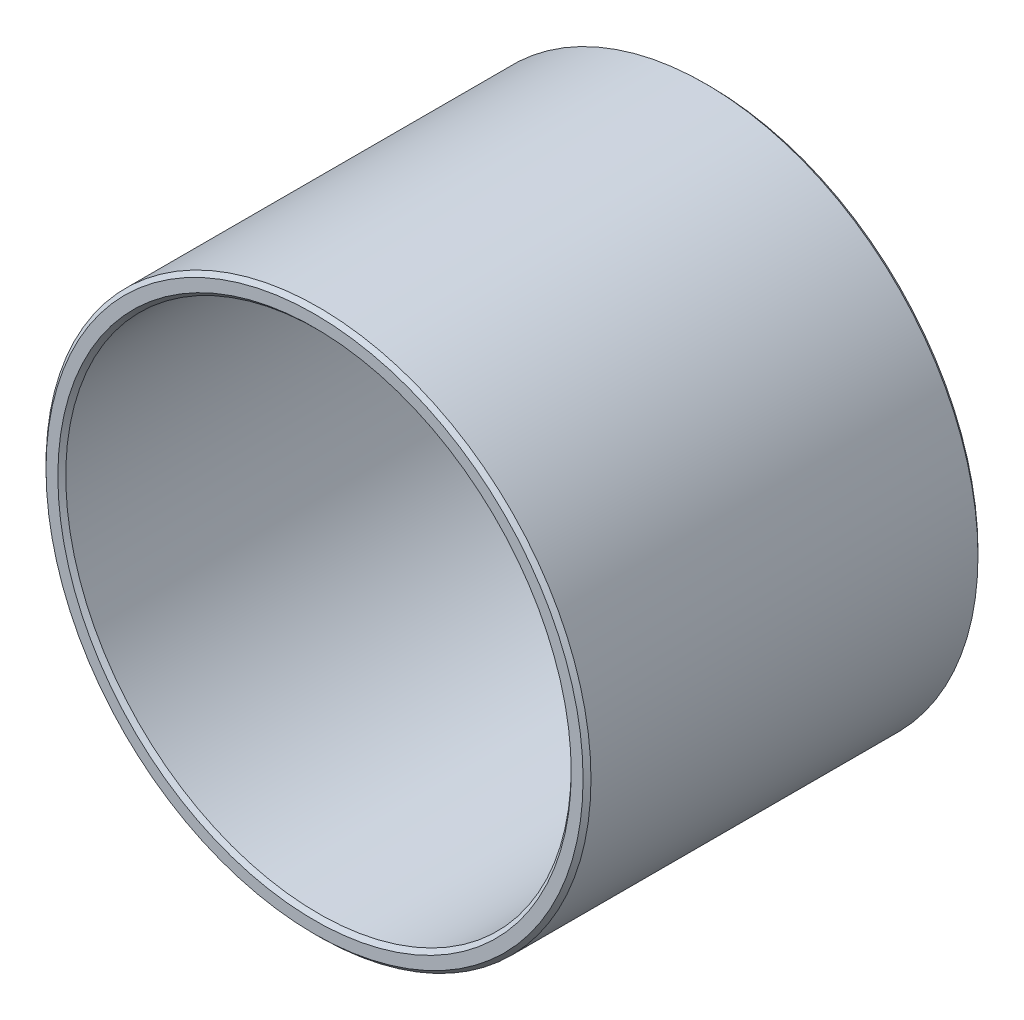
ISO-10303-21;
HEADER;
FILE_DESCRIPTION(('STEP AP214'),'2;1');
FILE_NAME('part.step','',(''),(''),'','','');
FILE_SCHEMA(('AUTOMOTIVE_DESIGN { 1 0 10303 214 1 1 1 1 }'));
ENDSEC;
DATA;
#1=APPLICATION_CONTEXT('core data for automotive mechanical design processes');
#2=APPLICATION_PROTOCOL_DEFINITION('international standard','automotive_design',2000,#1);
#3=PRODUCT_CONTEXT('',#1,'mechanical');
#4=PRODUCT('Part','Part','',(#3));
#5=PRODUCT_RELATED_PRODUCT_CATEGORY('part','',(#4));
#6=PRODUCT_DEFINITION_FORMATION('','',#4);
#7=PRODUCT_DEFINITION_CONTEXT('part definition',#1,'design');
#8=PRODUCT_DEFINITION('design','',#6,#7);
#9=PRODUCT_DEFINITION_SHAPE('','',#8);
#10=(LENGTH_UNIT() NAMED_UNIT(*) SI_UNIT(.MILLI.,.METRE.));
#11=(NAMED_UNIT(*) PLANE_ANGLE_UNIT() SI_UNIT($,.RADIAN.));
#12=(NAMED_UNIT(*) SI_UNIT($,.STERADIAN.) SOLID_ANGLE_UNIT());
#13=UNCERTAINTY_MEASURE_WITH_UNIT(LENGTH_MEASURE(1.E-05),#10,'distance_accuracy_value','');
#14=(GEOMETRIC_REPRESENTATION_CONTEXT(3) GLOBAL_UNCERTAINTY_ASSIGNED_CONTEXT((#13)) GLOBAL_UNIT_ASSIGNED_CONTEXT((#10,
#11,#12)) REPRESENTATION_CONTEXT('',''));
#15=CARTESIAN_POINT('',(0.,0.,0.));
#16=DIRECTION('',(0.,0.,1.));
#17=DIRECTION('',(1.,0.,0.));
#18=AXIS2_PLACEMENT_3D('',#15,#16,#17);
#19=CARTESIAN_POINT('',(0.,0.,-130.080735803744));
#20=DIRECTION('',(0.,0.,1.));
#21=DIRECTION('',(1.,0.,0.));
#22=AXIS2_PLACEMENT_3D('',#19,#20,#21);
#23=CYLINDRICAL_SURFACE('',#22,34.5);
#24=CARTESIAN_POINT('',(0.,0.,-32.));
#25=DIRECTION('',(0.,0.,1.));
#26=DIRECTION('',(1.,0.,0.));
#27=AXIS2_PLACEMENT_3D('',#24,#25,#26);
#28=CIRCLE('',#27,34.5);
#29=CARTESIAN_POINT('',(34.5,0.,-32.));
#30=VERTEX_POINT('',#29);
#31=EDGE_CURVE('E66',#30,#30,#28,.T.);
#32=ORIENTED_EDGE('',*,*,#31,.T.);
#33=EDGE_LOOP('',(#32));
#34=FACE_BOUND('',#33,.T.);
#35=CARTESIAN_POINT('',(0.,0.,17.));
#36=DIRECTION('',(0.,0.,1.));
#37=DIRECTION('',(1.,0.,0.));
#38=AXIS2_PLACEMENT_3D('',#35,#36,#37);
#39=CIRCLE('',#38,34.5);
#40=CARTESIAN_POINT('',(34.5,0.,17.));
#41=VERTEX_POINT('',#40);
#42=EDGE_CURVE('E69',#41,#41,#39,.F.);
#43=ORIENTED_EDGE('',*,*,#42,.T.);
#44=EDGE_LOOP('',(#43));
#45=FACE_BOUND('',#44,.T.);
#46=ADVANCED_FACE('F45',(#34,#45),#23,.T.);
#47=CARTESIAN_POINT('',(0.,0.,17.5));
#48=DIRECTION('',(0.,0.,1.));
#49=DIRECTION('',(1.,0.,0.));
#50=AXIS2_PLACEMENT_3D('',#47,#48,#49);
#51=PLANE('',#50);
#52=CARTESIAN_POINT('',(0.,0.,17.5));
#53=DIRECTION('',(0.,0.,1.));
#54=DIRECTION('',(1.,0.,0.));
#55=AXIS2_PLACEMENT_3D('',#52,#53,#54);
#56=CIRCLE('',#55,34.);
#57=CARTESIAN_POINT('',(34.,0.,17.5));
#58=VERTEX_POINT('',#57);
#59=EDGE_CURVE('E57',#58,#58,#56,.T.);
#60=ORIENTED_EDGE('',*,*,#59,.T.);
#61=EDGE_LOOP('',(#60));
#62=FACE_BOUND('',#61,.T.);
#63=CARTESIAN_POINT('',(0.,0.,17.5));
#64=DIRECTION('',(0.,0.,1.));
#65=DIRECTION('',(1.,0.,0.));
#66=AXIS2_PLACEMENT_3D('',#63,#64,#65);
#67=CIRCLE('',#66,32.5);
#68=CARTESIAN_POINT('',(32.5,0.,17.5));
#69=VERTEX_POINT('',#68);
#70=EDGE_CURVE('E61',#69,#69,#67,.F.);
#71=ORIENTED_EDGE('',*,*,#70,.T.);
#72=EDGE_LOOP('',(#71));
#73=FACE_BOUND('',#72,.T.);
#74=ADVANCED_FACE('F95',(#62,#73),#51,.T.);
#75=CARTESIAN_POINT('',(0.,0.,-130.080735803744));
#76=DIRECTION('',(0.,0.,1.));
#77=DIRECTION('',(1.,0.,0.));
#78=AXIS2_PLACEMENT_3D('',#75,#76,#77);
#79=CYLINDRICAL_SURFACE('',#78,32.);
#80=CARTESIAN_POINT('',(0.,0.,-32.));
#81=DIRECTION('',(0.,0.,1.));
#82=DIRECTION('',(1.,0.,0.));
#83=AXIS2_PLACEMENT_3D('',#80,#81,#82);
#84=CIRCLE('',#83,32.);
#85=CARTESIAN_POINT('',(32.,0.,-32.));
#86=VERTEX_POINT('',#85);
#87=EDGE_CURVE('E11',#86,#86,#84,.F.);
#88=ORIENTED_EDGE('',*,*,#87,.T.);
#89=EDGE_LOOP('',(#88));
#90=FACE_BOUND('',#89,.T.);
#91=CARTESIAN_POINT('',(0.,0.,17.));
#92=DIRECTION('',(0.,0.,1.));
#93=DIRECTION('',(1.,0.,0.));
#94=AXIS2_PLACEMENT_3D('',#91,#92,#93);
#95=CIRCLE('',#94,32.);
#96=CARTESIAN_POINT('',(32.,0.,17.));
#97=VERTEX_POINT('',#96);
#98=EDGE_CURVE('E53',#97,#97,#95,.T.);
#99=ORIENTED_EDGE('',*,*,#98,.T.);
#100=EDGE_LOOP('',(#99));
#101=FACE_BOUND('',#100,.T.);
#102=ADVANCED_FACE('F101',(#90,#101),#79,.F.);
#103=CARTESIAN_POINT('',(0.,0.,-32.5));
#104=DIRECTION('',(0.,0.,1.));
#105=DIRECTION('',(1.,0.,0.));
#106=AXIS2_PLACEMENT_3D('',#103,#104,#105);
#107=PLANE('',#106);
#108=CARTESIAN_POINT('',(0.,0.,-32.5));
#109=DIRECTION('',(0.,0.,1.));
#110=DIRECTION('',(1.,0.,0.));
#111=AXIS2_PLACEMENT_3D('',#108,#109,#110);
#112=CIRCLE('',#111,34.);
#113=CARTESIAN_POINT('',(34.,0.,-32.5));
#114=VERTEX_POINT('',#113);
#115=EDGE_CURVE('E72',#114,#114,#112,.F.);
#116=ORIENTED_EDGE('',*,*,#115,.T.);
#117=EDGE_LOOP('',(#116));
#118=FACE_BOUND('',#117,.T.);
#119=CARTESIAN_POINT('',(0.,0.,-32.5));
#120=DIRECTION('',(0.,0.,1.));
#121=DIRECTION('',(1.,0.,0.));
#122=AXIS2_PLACEMENT_3D('',#119,#120,#121);
#123=CIRCLE('',#122,32.5);
#124=CARTESIAN_POINT('',(32.5,0.,-32.5));
#125=VERTEX_POINT('',#124);
#126=EDGE_CURVE('E75',#125,#125,#123,.T.);
#127=ORIENTED_EDGE('',*,*,#126,.T.);
#128=EDGE_LOOP('',(#127));
#129=FACE_BOUND('',#128,.T.);
#130=ADVANCED_FACE('F79',(#118,#129),#107,.F.);
#131=CARTESIAN_POINT('',(0.,0.,-32.5));
#132=DIRECTION('',(0.,0.,1.));
#133=DIRECTION('',(1.,0.,0.));
#134=AXIS2_PLACEMENT_3D('',#131,#132,#133);
#135=CONICAL_SURFACE('',#134,34.,0.785398163397455);
#136=ORIENTED_EDGE('',*,*,#31,.F.);
#137=EDGE_LOOP('',(#136));
#138=FACE_BOUND('',#137,.T.);
#139=ORIENTED_EDGE('',*,*,#115,.F.);
#140=EDGE_LOOP('',(#139));
#141=FACE_BOUND('',#140,.T.);
#142=ADVANCED_FACE('F90',(#138,#141),#135,.T.);
#143=CARTESIAN_POINT('',(0.,0.,17.5));
#144=DIRECTION('',(0.,0.,-1.));
#145=DIRECTION('',(-1.,0.,0.));
#146=AXIS2_PLACEMENT_3D('',#143,#144,#145);
#147=CONICAL_SURFACE('',#146,34.,0.785398163397483);
#148=ORIENTED_EDGE('',*,*,#42,.F.);
#149=EDGE_LOOP('',(#148));
#150=FACE_BOUND('',#149,.T.);
#151=ORIENTED_EDGE('',*,*,#59,.F.);
#152=EDGE_LOOP('',(#151));
#153=FACE_BOUND('',#152,.T.);
#154=ADVANCED_FACE('F84',(#150,#153),#147,.T.);
#155=CARTESIAN_POINT('',(0.,0.,-32.));
#156=DIRECTION('',(0.,0.,-1.));
#157=DIRECTION('',(-1.,0.,0.));
#158=AXIS2_PLACEMENT_3D('',#155,#156,#157);
#159=CONICAL_SURFACE('',#158,32.,0.785398163397435);
#160=ORIENTED_EDGE('',*,*,#126,.F.);
#161=EDGE_LOOP('',(#160));
#162=FACE_BOUND('',#161,.T.);
#163=ORIENTED_EDGE('',*,*,#87,.F.);
#164=EDGE_LOOP('',(#163));
#165=FACE_BOUND('',#164,.T.);
#166=ADVANCED_FACE('F81',(#162,#165),#159,.F.);
#167=CARTESIAN_POINT('',(0.,0.,17.));
#168=DIRECTION('',(0.,0.,1.));
#169=DIRECTION('',(1.,0.,0.));
#170=AXIS2_PLACEMENT_3D('',#167,#168,#169);
#171=CONICAL_SURFACE('',#170,32.,0.785398163397462);
#172=ORIENTED_EDGE('',*,*,#70,.F.);
#173=EDGE_LOOP('',(#172));
#174=FACE_BOUND('',#173,.T.);
#175=ORIENTED_EDGE('',*,*,#98,.F.);
#176=EDGE_LOOP('',(#175));
#177=FACE_BOUND('',#176,.T.);
#178=ADVANCED_FACE('F48',(#174,#177),#171,.F.);
#179=CLOSED_SHELL('',(#46,#74,#102,#130,#142,#154,#166,#178));
#180=MANIFOLD_SOLID_BREP('B2',#179);
#181=ADVANCED_BREP_SHAPE_REPRESENTATION('',(#18,#180),#14);
#182=SHAPE_DEFINITION_REPRESENTATION(#9,#181);
ENDSEC;
END-ISO-10303-21;
